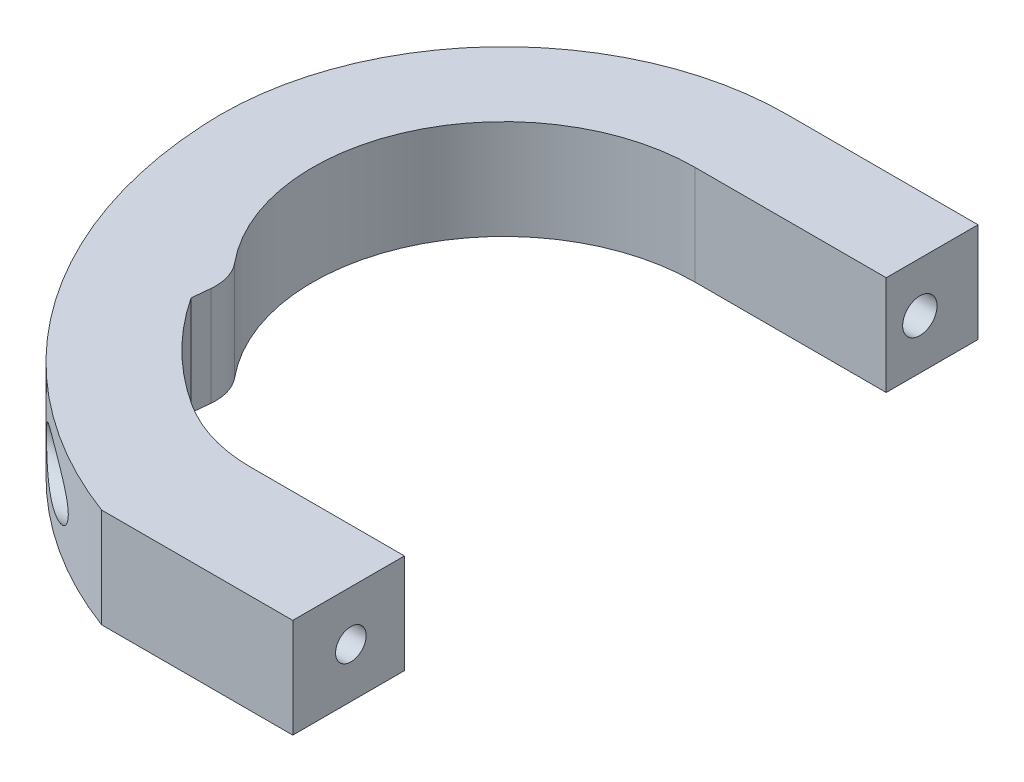
ISO-10303-21;
HEADER;
FILE_DESCRIPTION(('STEP AP214'),'2;1');
FILE_NAME('part.step','',(''),(''),'','','');
FILE_SCHEMA(('AUTOMOTIVE_DESIGN { 1 0 10303 214 1 1 1 1 }'));
ENDSEC;
DATA;
#1=APPLICATION_CONTEXT('core data for automotive mechanical design processes');
#2=APPLICATION_PROTOCOL_DEFINITION('international standard','automotive_design',2000,#1);
#3=PRODUCT_CONTEXT('',#1,'mechanical');
#4=PRODUCT('Part','Part','',(#3));
#5=PRODUCT_RELATED_PRODUCT_CATEGORY('part','',(#4));
#6=PRODUCT_DEFINITION_FORMATION('','',#4);
#7=PRODUCT_DEFINITION_CONTEXT('part definition',#1,'design');
#8=PRODUCT_DEFINITION('design','',#6,#7);
#9=PRODUCT_DEFINITION_SHAPE('','',#8);
#10=(LENGTH_UNIT() NAMED_UNIT(*) SI_UNIT(.MILLI.,.METRE.));
#11=(NAMED_UNIT(*) PLANE_ANGLE_UNIT() SI_UNIT($,.RADIAN.));
#12=(NAMED_UNIT(*) SI_UNIT($,.STERADIAN.) SOLID_ANGLE_UNIT());
#13=UNCERTAINTY_MEASURE_WITH_UNIT(LENGTH_MEASURE(1.E-05),#10,'distance_accuracy_value','');
#14=(GEOMETRIC_REPRESENTATION_CONTEXT(3) GLOBAL_UNCERTAINTY_ASSIGNED_CONTEXT((#13)) GLOBAL_UNIT_ASSIGNED_CONTEXT((#10,
#11,#12)) REPRESENTATION_CONTEXT('',''));
#15=CARTESIAN_POINT('',(0.,0.,0.));
#16=DIRECTION('',(0.,0.,1.));
#17=DIRECTION('',(1.,0.,0.));
#18=AXIS2_PLACEMENT_3D('',#15,#16,#17);
#19=CARTESIAN_POINT('',(2.43445709116473,12.5,9.));
#20=DIRECTION('',(0.,-1.,0.));
#21=DIRECTION('',(0.,0.,-1.));
#22=AXIS2_PLACEMENT_3D('',#19,#20,#21);
#23=CYLINDRICAL_SURFACE('',#22,10.);
#24=DIRECTION('',(0.,-1.,0.));
#25=VECTOR('',#24,1.);
#26=CARTESIAN_POINT('',(-2.98185755779115,12.5,17.4061605756437));
#27=LINE('',#26,#25);
#28=CARTESIAN_POINT('',(-2.98185755779116,6.5,17.4061605756437));
#29=VERTEX_POINT('',#28);
#30=CARTESIAN_POINT('',(-2.98185755779114,0.,17.4061605756437));
#31=VERTEX_POINT('',#30);
#32=EDGE_CURVE('E257',#29,#31,#27,.T.);
#33=ORIENTED_EDGE('',*,*,#32,.F.);
#34=CARTESIAN_POINT('',(2.43445709116473,6.5,9.));
#35=DIRECTION('',(0.,1.,0.));
#36=DIRECTION('',(0.,0.,1.));
#37=AXIS2_PLACEMENT_3D('',#34,#35,#36);
#38=CIRCLE('',#37,10.);
#39=CARTESIAN_POINT('',(2.43445709116473,6.5,19.));
#40=VERTEX_POINT('',#39);
#41=EDGE_CURVE('E50',#29,#40,#38,.T.);
#42=ORIENTED_EDGE('',*,*,#41,.T.);
#43=DIRECTION('',(0.,1.,0.));
#44=VECTOR('',#43,1.);
#45=CARTESIAN_POINT('',(2.43445709116473,12.5,19.));
#46=LINE('',#45,#44);
#47=CARTESIAN_POINT('',(2.43445709116473,0.,19.));
#48=VERTEX_POINT('',#47);
#49=EDGE_CURVE('E260',#48,#40,#46,.T.);
#50=ORIENTED_EDGE('',*,*,#49,.F.);
#51=CARTESIAN_POINT('',(2.43445709116473,0.,9.));
#52=DIRECTION('',(0.,1.,0.));
#53=DIRECTION('',(0.,0.,1.));
#54=AXIS2_PLACEMENT_3D('',#51,#52,#53);
#55=CIRCLE('',#54,10.);
#56=EDGE_CURVE('E11',#48,#31,#55,.F.);
#57=ORIENTED_EDGE('',*,*,#56,.T.);
#58=EDGE_LOOP('',(#33,#42,#50,#57));
#59=FACE_BOUND('',#58,.T.);
#60=ADVANCED_FACE('F37',(#59),#23,.F.);
#61=CARTESIAN_POINT('',(-11.9488198698751,6.5,9.87297846231208));
#62=DIRECTION('',(0.,-1.,0.));
#63=DIRECTION('',(0.,0.,-1.));
#64=AXIS2_PLACEMENT_3D('',#61,#62,#63);
#65=CYLINDRICAL_SURFACE('',#64,3.);
#66=DIRECTION('',(0.,1.,0.));
#67=VECTOR('',#66,1.);
#68=CARTESIAN_POINT('',(-8.96359133315928,6.5,10.1703176349375));
#69=LINE('',#68,#67);
#70=CARTESIAN_POINT('',(-8.96359133315928,0.,10.1703176349375));
#71=VERTEX_POINT('',#70);
#72=CARTESIAN_POINT('',(-8.96359133315928,6.5,10.1703176349375));
#73=VERTEX_POINT('',#72);
#74=EDGE_CURVE('E241',#71,#73,#69,.T.);
#75=ORIENTED_EDGE('',*,*,#74,.F.);
#76=CARTESIAN_POINT('',(-11.9488198698751,0.,9.87297846231208));
#77=DIRECTION('',(0.,1.,0.));
#78=DIRECTION('',(0.,0.,1.));
#79=AXIS2_PLACEMENT_3D('',#76,#77,#78);
#80=CIRCLE('',#79,3.);
#81=CARTESIAN_POINT('',(-9.63614505635088,0.,7.96207940509039));
#82=VERTEX_POINT('',#81);
#83=EDGE_CURVE('E253',#82,#71,#80,.F.);
#84=ORIENTED_EDGE('',*,*,#83,.F.);
#85=DIRECTION('',(0.,-1.,0.));
#86=VECTOR('',#85,1.);
#87=CARTESIAN_POINT('',(-9.63614505635088,6.5,7.96207940509039));
#88=LINE('',#87,#86);
#89=CARTESIAN_POINT('',(-9.63614505635088,6.5,7.96207940509039));
#90=VERTEX_POINT('',#89);
#91=EDGE_CURVE('E249',#90,#82,#88,.T.);
#92=ORIENTED_EDGE('',*,*,#91,.F.);
#93=CARTESIAN_POINT('',(-11.9488198698751,6.5,9.87297846231208));
#94=DIRECTION('',(0.,1.,0.));
#95=DIRECTION('',(0.,0.,1.));
#96=AXIS2_PLACEMENT_3D('',#93,#94,#95);
#97=CIRCLE('',#96,3.);
#98=EDGE_CURVE('E255',#73,#90,#97,.T.);
#99=ORIENTED_EDGE('',*,*,#98,.F.);
#100=EDGE_LOOP('',(#75,#84,#92,#99));
#101=FACE_BOUND('',#100,.T.);
#102=ADVANCED_FACE('F224',(#101),#65,.T.);
#103=CARTESIAN_POINT('',(0.,6.5,0.));
#104=DIRECTION('',(0.,1.,0.));
#105=DIRECTION('',(0.,0.,1.));
#106=AXIS2_PLACEMENT_3D('',#103,#104,#105);
#107=PLANE('',#106);
#108=DIRECTION('',(-0.0991130575418176,0.,0.99507617890527));
#109=VECTOR('',#108,1.);
#110=CARTESIAN_POINT('',(-7.87249039663224,6.5,-0.784127497190442));
#111=LINE('',#110,#109);
#112=CARTESIAN_POINT('',(-9.08243059939972,6.5,11.3634411838156));
#113=VERTEX_POINT('',#112);
#114=EDGE_CURVE('E183',#73,#113,#111,.T.);
#115=ORIENTED_EDGE('',*,*,#114,.F.);
#116=ORIENTED_EDGE('',*,*,#98,.T.);
#117=CARTESIAN_POINT('',(0.,6.5,0.));
#118=DIRECTION('',(0.,1.,0.));
#119=DIRECTION('',(0.,0.,1.));
#120=AXIS2_PLACEMENT_3D('',#117,#118,#119);
#121=CIRCLE('',#120,12.5);
#122=CARTESIAN_POINT('',(0.,6.5,-12.5));
#123=VERTEX_POINT('',#122);
#124=EDGE_CURVE('E297',#123,#90,#121,.T.);
#125=ORIENTED_EDGE('',*,*,#124,.F.);
#126=DIRECTION('',(-1.,0.,0.));
#127=VECTOR('',#126,1.);
#128=CARTESIAN_POINT('',(12.5,6.5,-12.5));
#129=LINE('',#128,#127);
#130=CARTESIAN_POINT('',(12.5,6.5,-12.5));
#131=VERTEX_POINT('',#130);
#132=EDGE_CURVE('E557',#131,#123,#129,.T.);
#133=ORIENTED_EDGE('',*,*,#132,.F.);
#134=DIRECTION('',(0.,0.,1.));
#135=VECTOR('',#134,1.);
#136=CARTESIAN_POINT('',(12.5,6.5,-12.5));
#137=LINE('',#136,#135);
#138=CARTESIAN_POINT('',(12.5,6.5,-18.5));
#139=VERTEX_POINT('',#138);
#140=EDGE_CURVE('E555',#139,#131,#137,.T.);
#141=ORIENTED_EDGE('',*,*,#140,.F.);
#142=DIRECTION('',(-1.,0.,0.));
#143=VECTOR('',#142,1.);
#144=CARTESIAN_POINT('',(12.5,6.5,-18.5));
#145=LINE('',#144,#143);
#146=CARTESIAN_POINT('',(0.,6.5,-18.5));
#147=VERTEX_POINT('',#146);
#148=EDGE_CURVE('E559',#139,#147,#145,.T.);
#149=ORIENTED_EDGE('',*,*,#148,.T.);
#150=CARTESIAN_POINT('',(0.,6.5,0.));
#151=DIRECTION('',(0.,1.,0.));
#152=DIRECTION('',(0.,0.,1.));
#153=AXIS2_PLACEMENT_3D('',#150,#151,#152);
#154=CIRCLE('',#153,18.5);
#155=CARTESIAN_POINT('',(-18.5,6.5,0.));
#156=VERTEX_POINT('',#155);
#157=EDGE_CURVE('E305',#147,#156,#154,.T.);
#158=ORIENTED_EDGE('',*,*,#157,.T.);
#159=CARTESIAN_POINT('',(-18.5,6.5,0.));
#160=CARTESIAN_POINT('',(-18.492115944136,6.5,0.64590870857176));
#161=CARTESIAN_POINT('',(-18.4549140462684,6.5,1.29079337805996));
#162=B_SPLINE_CURVE_WITH_KNOTS('',2,(#159,#160,#161),.UNSPECIFIED.,.F.,.F.,(3,3),(0.,1.),.UNSPECIFIED.);
#163=CARTESIAN_POINT('',(-18.4549140462684,6.5,1.29079337805996));
#164=VERTEX_POINT('',#163);
#165=EDGE_CURVE('E250',#156,#164,#162,.T.);
#166=ORIENTED_EDGE('',*,*,#165,.T.);
#167=CARTESIAN_POINT('',(9.9377916954311,6.5,-0.347115831386899));
#168=DIRECTION('',(0.,1.,0.));
#169=DIRECTION('',(0.,0.,1.));
#170=AXIS2_PLACEMENT_3D('',#167,#168,#169);
#171=CIRCLE('',#170,28.4399100897511);
#172=CARTESIAN_POINT('',(0.,6.5,26.3));
#173=VERTEX_POINT('',#172);
#174=EDGE_CURVE('E185',#173,#164,#171,.F.);
#175=ORIENTED_EDGE('',*,*,#174,.F.);
#176=DIRECTION('',(-1.,0.,0.));
#177=VECTOR('',#176,1.);
#178=CARTESIAN_POINT('',(12.5,6.5,26.3));
#179=LINE('',#178,#177);
#180=CARTESIAN_POINT('',(12.5,6.5,26.3));
#181=VERTEX_POINT('',#180);
#182=EDGE_CURVE('E277',#181,#173,#179,.T.);
#183=ORIENTED_EDGE('',*,*,#182,.F.);
#184=DIRECTION('',(0.,0.,1.));
#185=VECTOR('',#184,1.);
#186=CARTESIAN_POINT('',(12.5,6.5,26.3));
#187=LINE('',#186,#185);
#188=CARTESIAN_POINT('',(12.5,6.5,19.));
#189=VERTEX_POINT('',#188);
#190=EDGE_CURVE('E158',#189,#181,#187,.T.);
#191=ORIENTED_EDGE('',*,*,#190,.F.);
#192=DIRECTION('',(-1.,0.,0.));
#193=VECTOR('',#192,1.);
#194=CARTESIAN_POINT('',(12.5,6.5,19.));
#195=LINE('',#194,#193);
#196=EDGE_CURVE('E171',#189,#40,#195,.T.);
#197=ORIENTED_EDGE('',*,*,#196,.T.);
#198=ORIENTED_EDGE('',*,*,#41,.F.);
#199=CARTESIAN_POINT('',(8.26533127007783,6.5,-0.0495600461038349));
#200=DIRECTION('',(0.,1.,0.));
#201=DIRECTION('',(0.,0.,1.));
#202=AXIS2_PLACEMENT_3D('',#199,#200,#201);
#203=CIRCLE('',#202,20.7653904117944);
#204=EDGE_CURVE('E180',#113,#29,#203,.T.);
#205=ORIENTED_EDGE('',*,*,#204,.F.);
#206=EDGE_LOOP('',(#115,#116,#125,#133,#141,#149,#158,#166,#175,#183,#191,#197,#198,#205));
#207=FACE_BOUND('',#206,.T.);
#208=ADVANCED_FACE('F282',(#207),#107,.T.);
#209=CARTESIAN_POINT('',(0.,0.,0.));
#210=DIRECTION('',(0.,1.,0.));
#211=DIRECTION('',(0.,0.,1.));
#212=AXIS2_PLACEMENT_3D('',#209,#210,#211);
#213=PLANE('',#212);
#214=CARTESIAN_POINT('',(0.,0.,0.));
#215=DIRECTION('',(0.,1.,0.));
#216=DIRECTION('',(0.,0.,1.));
#217=AXIS2_PLACEMENT_3D('',#214,#215,#216);
#218=CIRCLE('',#217,12.5);
#219=CARTESIAN_POINT('',(0.,0.,-12.5));
#220=VERTEX_POINT('',#219);
#221=EDGE_CURVE('E303',#220,#82,#218,.T.);
#222=ORIENTED_EDGE('',*,*,#221,.T.);
#223=ORIENTED_EDGE('',*,*,#83,.T.);
#224=DIRECTION('',(0.0991130575418176,0.,-0.99507617890527));
#225=VECTOR('',#224,1.);
#226=CARTESIAN_POINT('',(-7.87249039663224,0.,-0.784127497190442));
#227=LINE('',#226,#225);
#228=CARTESIAN_POINT('',(-9.08243059939972,0.,11.3634411838156));
#229=VERTEX_POINT('',#228);
#230=EDGE_CURVE('E169',#229,#71,#227,.T.);
#231=ORIENTED_EDGE('',*,*,#230,.F.);
#232=CARTESIAN_POINT('',(8.26533127007783,0.,-0.0495600461038349));
#233=DIRECTION('',(0.,-1.,0.));
#234=DIRECTION('',(0.,0.,-1.));
#235=AXIS2_PLACEMENT_3D('',#232,#233,#234);
#236=CIRCLE('',#235,20.7653904117944);
#237=EDGE_CURVE('E167',#31,#229,#236,.T.);
#238=ORIENTED_EDGE('',*,*,#237,.F.);
#239=ORIENTED_EDGE('',*,*,#56,.F.);
#240=DIRECTION('',(-1.,0.,0.));
#241=VECTOR('',#240,1.);
#242=CARTESIAN_POINT('',(12.5,0.,19.));
#243=LINE('',#242,#241);
#244=CARTESIAN_POINT('',(12.5,0.,19.));
#245=VERTEX_POINT('',#244);
#246=EDGE_CURVE('E148',#245,#48,#243,.T.);
#247=ORIENTED_EDGE('',*,*,#246,.F.);
#248=DIRECTION('',(0.,0.,-1.));
#249=VECTOR('',#248,1.);
#250=CARTESIAN_POINT('',(12.5,0.,26.3));
#251=LINE('',#250,#249);
#252=CARTESIAN_POINT('',(12.5,0.,26.3));
#253=VERTEX_POINT('',#252);
#254=EDGE_CURVE('E139',#253,#245,#251,.T.);
#255=ORIENTED_EDGE('',*,*,#254,.F.);
#256=DIRECTION('',(-1.,0.,0.));
#257=VECTOR('',#256,1.);
#258=CARTESIAN_POINT('',(12.5,0.,26.3));
#259=LINE('',#258,#257);
#260=CARTESIAN_POINT('',(0.,0.,26.3));
#261=VERTEX_POINT('',#260);
#262=EDGE_CURVE('E145',#253,#261,#259,.T.);
#263=ORIENTED_EDGE('',*,*,#262,.T.);
#264=CARTESIAN_POINT('',(9.9377916954311,0.,-0.347115831386899));
#265=DIRECTION('',(0.,1.,0.));
#266=DIRECTION('',(0.,0.,1.));
#267=AXIS2_PLACEMENT_3D('',#264,#265,#266);
#268=CIRCLE('',#267,28.4399100897511);
#269=CARTESIAN_POINT('',(-18.4549140462684,0.,1.29079337805996));
#270=VERTEX_POINT('',#269);
#271=EDGE_CURVE('E187',#261,#270,#268,.F.);
#272=ORIENTED_EDGE('',*,*,#271,.T.);
#273=CARTESIAN_POINT('',(0.,0.,0.));
#274=DIRECTION('',(0.,1.,0.));
#275=DIRECTION('',(-1.,0.,0.));
#276=AXIS2_PLACEMENT_3D('',#273,#274,#275);
#277=CIRCLE('',#276,18.5);
#278=CARTESIAN_POINT('',(-18.5,0.,1.9260851594205E-13));
#279=VERTEX_POINT('',#278);
#280=EDGE_CURVE('E196',#279,#270,#277,.T.);
#281=ORIENTED_EDGE('',*,*,#280,.F.);
#282=CARTESIAN_POINT('',(0.,0.,0.));
#283=DIRECTION('',(0.,1.,0.));
#284=DIRECTION('',(0.,0.,1.));
#285=AXIS2_PLACEMENT_3D('',#282,#283,#284);
#286=CIRCLE('',#285,18.5);
#287=CARTESIAN_POINT('',(0.,0.,-18.5));
#288=VERTEX_POINT('',#287);
#289=EDGE_CURVE('E198',#288,#279,#286,.T.);
#290=ORIENTED_EDGE('',*,*,#289,.F.);
#291=DIRECTION('',(-1.,0.,0.));
#292=VECTOR('',#291,1.);
#293=CARTESIAN_POINT('',(12.5,0.,-18.5));
#294=LINE('',#293,#292);
#295=CARTESIAN_POINT('',(12.5,0.,-18.5));
#296=VERTEX_POINT('',#295);
#297=EDGE_CURVE('E561',#296,#288,#294,.T.);
#298=ORIENTED_EDGE('',*,*,#297,.F.);
#299=DIRECTION('',(0.,0.,-1.));
#300=VECTOR('',#299,1.);
#301=CARTESIAN_POINT('',(12.5,0.,-12.5));
#302=LINE('',#301,#300);
#303=CARTESIAN_POINT('',(12.5,0.,-12.5));
#304=VERTEX_POINT('',#303);
#305=EDGE_CURVE('E551',#304,#296,#302,.T.);
#306=ORIENTED_EDGE('',*,*,#305,.F.);
#307=DIRECTION('',(-1.,0.,0.));
#308=VECTOR('',#307,1.);
#309=CARTESIAN_POINT('',(12.5,0.,-12.5));
#310=LINE('',#309,#308);
#311=EDGE_CURVE('E562',#304,#220,#310,.T.);
#312=ORIENTED_EDGE('',*,*,#311,.T.);
#313=EDGE_LOOP('',(#222,#223,#231,#238,#239,#247,#255,#263,#272,#281,#290,#298,#306,#312));
#314=FACE_BOUND('',#313,.T.);
#315=ADVANCED_FACE('F142',(#314),#213,.F.);
#316=CARTESIAN_POINT('',(-18.5,3.25,-14.7));
#317=DIRECTION('',(1.,0.,0.));
#318=DIRECTION('',(0.,0.,-1.));
#319=AXIS2_PLACEMENT_3D('',#316,#317,#318);
#320=CYLINDRICAL_SURFACE('',#319,1.125);
#321=CARTESIAN_POINT('',(12.5,3.25,-14.7));
#322=DIRECTION('',(1.,0.,0.));
#323=DIRECTION('',(0.,0.,-1.));
#324=AXIS2_PLACEMENT_3D('',#321,#322,#323);
#325=CIRCLE('',#324,1.125);
#326=CARTESIAN_POINT('',(12.5,3.25,-15.825));
#327=VERTEX_POINT('',#326);
#328=EDGE_CURVE('E541',#327,#327,#325,.T.);
#329=ORIENTED_EDGE('',*,*,#328,.T.);
#330=EDGE_LOOP('',(#329));
#331=FACE_BOUND('',#330,.T.);
#332=CARTESIAN_POINT('',(6.,3.25,-14.7));
#333=DIRECTION('',(-1.,0.,0.));
#334=DIRECTION('',(0.,0.,1.));
#335=AXIS2_PLACEMENT_3D('',#332,#333,#334);
#336=CIRCLE('',#335,1.125);
#337=CARTESIAN_POINT('',(6.,3.25,-13.575));
#338=VERTEX_POINT('',#337);
#339=EDGE_CURVE('E537',#338,#338,#336,.F.);
#340=ORIENTED_EDGE('',*,*,#339,.F.);
#341=EDGE_LOOP('',(#340));
#342=FACE_BOUND('',#341,.T.);
#343=ADVANCED_FACE('F221',(#331,#342),#320,.F.);
#344=CARTESIAN_POINT('',(0.,6.5,0.));
#345=DIRECTION('',(0.,-1.,0.));
#346=DIRECTION('',(0.,0.,-1.));
#347=AXIS2_PLACEMENT_3D('',#344,#345,#346);
#348=CYLINDRICAL_SURFACE('',#347,18.5);
#349=ORIENTED_EDGE('',*,*,#280,.T.);
#350=DIRECTION('',(0.,-1.,0.));
#351=VECTOR('',#350,1.);
#352=CARTESIAN_POINT('',(-18.4549140462684,3.25,1.29079337805996));
#353=LINE('',#352,#351);
#354=EDGE_CURVE('E192',#270,#164,#353,.F.);
#355=ORIENTED_EDGE('',*,*,#354,.T.);
#356=ORIENTED_EDGE('',*,*,#165,.F.);
#357=ORIENTED_EDGE('',*,*,#157,.F.);
#358=DIRECTION('',(0.,-1.,0.));
#359=VECTOR('',#358,1.);
#360=CARTESIAN_POINT('',(0.,6.5,-18.5));
#361=LINE('',#360,#359);
#362=EDGE_CURVE('E306',#288,#147,#361,.F.);
#363=ORIENTED_EDGE('',*,*,#362,.F.);
#364=ORIENTED_EDGE('',*,*,#289,.T.);
#365=EDGE_LOOP('',(#349,#355,#356,#357,#363,#364));
#366=FACE_BOUND('',#365,.T.);
#367=CARTESIAN_POINT('',(-8.16639455328972,3.25,-16.6));
#368=CARTESIAN_POINT('',(-8.16640173482986,3.30186255349435,-16.5999967198748));
#369=CARTESIAN_POINT('',(-8.17076986025715,3.35380327107177,-16.5978497332591));
#370=CARTESIAN_POINT('',(-8.18771271861935,3.45603129124821,-16.5894979715708));
#371=CARTESIAN_POINT('',(-8.20030876480127,3.50631394253375,-16.5832826579947));
#372=CARTESIAN_POINT('',(-8.23661496116308,3.61691041266235,-16.5652852893057));
#373=CARTESIAN_POINT('',(-8.26238049128577,3.67637110030953,-16.5524672318081));
#374=CARTESIAN_POINT('',(-8.32191280967712,3.78993830617922,-16.522617284212));
#375=CARTESIAN_POINT('',(-8.3556953522869,3.84403398093558,-16.5055770941987));
#376=CARTESIAN_POINT('',(-8.45357731244129,3.98199387013994,-16.4557498567179));
#377=CARTESIAN_POINT('',(-8.52271234365229,4.06120257709374,-16.4201147607703));
#378=CARTESIAN_POINT('',(-8.6696341102887,4.20778062020223,-16.3430234261123));
#379=CARTESIAN_POINT('',(-8.74744496258733,4.27511553942186,-16.3015508722591));
#380=CARTESIAN_POINT('',(-8.90659658164503,4.39888443990974,-16.215134383934));
#381=CARTESIAN_POINT('',(-8.98783946025734,4.4555047127047,-16.170273498203));
#382=CARTESIAN_POINT('',(-9.15343353028854,4.56091447949631,-16.0771173158474));
#383=CARTESIAN_POINT('',(-9.23778743841026,4.60969692001882,-16.0288189815402));
#384=CARTESIAN_POINT('',(-9.40859495269877,4.70041753962559,-15.9291600498971));
#385=CARTESIAN_POINT('',(-9.49505242378449,4.74234182331844,-15.8777935164441));
#386=CARTESIAN_POINT('',(-9.66917842584711,4.81981532970054,-15.7723606055975));
#387=CARTESIAN_POINT('',(-9.75684724844059,4.85536298745513,-15.7182935696045));
#388=CARTESIAN_POINT('',(-9.96973097788036,4.9340379050052,-15.5844857746232));
#389=CARTESIAN_POINT('',(-10.0952907156763,4.97410286236688,-15.5034774667946));
#390=CARTESIAN_POINT('',(-10.3466608595466,5.04234685391553,-15.3368632547554));
#391=CARTESIAN_POINT('',(-10.4724713599461,5.07051989869334,-15.2512550582023));
#392=CARTESIAN_POINT('',(-10.7231940246681,5.11460644907582,-15.0760225806637));
#393=CARTESIAN_POINT('',(-10.8481072183535,5.13053747375495,-14.9864042336747));
#394=CARTESIAN_POINT('',(-11.0962185935563,5.14939212090841,-14.8036371334364));
#395=CARTESIAN_POINT('',(-11.2194177359257,5.15232334989638,-14.710490476882));
#396=CARTESIAN_POINT('',(-11.5018292394835,5.1426264649113,-14.4913465908793));
#397=CARTESIAN_POINT('',(-11.660091638344,5.12477728353632,-14.3642872272495));
#398=CARTESIAN_POINT('',(-11.9688324498059,5.06025196409398,-14.1080492970735));
#399=CARTESIAN_POINT('',(-12.1193239425898,5.01362609968841,-13.9788748080091));
#400=CARTESIAN_POINT('',(-12.3658522910293,4.90462447661389,-13.7606131400659));
#401=CARTESIAN_POINT('',(-12.4649923046703,4.85077944816442,-13.6707985129316));
#402=CARTESIAN_POINT('',(-12.65440441278,4.72350851991878,-13.4956497068659));
#403=CARTESIAN_POINT('',(-12.7446885821978,4.65010980400972,-13.4103095031435));
#404=CARTESIAN_POINT('',(-12.8909326614921,4.50353520992022,-13.2695664699849));
#405=CARTESIAN_POINT('',(-12.9497398729216,4.4351835023944,-13.2121188677211));
#406=CARTESIAN_POINT('',(-13.0582706890999,4.28629842112052,-13.1048601889965));
#407=CARTESIAN_POINT('',(-13.1080063524963,4.20578148274493,-13.0550389892753));
#408=CARTESIAN_POINT('',(-13.1876805787623,4.04930508028899,-12.9745014172421));
#409=CARTESIAN_POINT('',(-13.2195813196159,3.97529492222092,-12.9419549144856));
#410=CARTESIAN_POINT('',(-13.2742443497292,3.82072077024941,-12.8858828076323));
#411=CARTESIAN_POINT('',(-13.2970112704493,3.74016012287169,-12.8623526319243));
#412=CARTESIAN_POINT('',(-13.332204564795,3.57391655292425,-12.8258716001936));
#413=CARTESIAN_POINT('',(-13.3445674185757,3.48820554001581,-12.8129857394758));
#414=CARTESIAN_POINT('',(-13.3578616768124,3.31495185264707,-12.7991262468118));
#415=CARTESIAN_POINT('',(-13.3587978877214,3.22740996384168,-12.7981476062654));
#416=CARTESIAN_POINT('',(-13.3496854433465,3.06256323928939,-12.8076509893484));
#417=CARTESIAN_POINT('',(-13.3407464655187,2.98512427743931,-12.8169752905124));
#418=CARTESIAN_POINT('',(-13.3141299544623,2.83344827289181,-12.8446217575379));
#419=CARTESIAN_POINT('',(-13.2964522311032,2.75921129989889,-12.8629441191718));
#420=CARTESIAN_POINT('',(-13.2527305399352,2.61390678128023,-12.9079870670832));
#421=CARTESIAN_POINT('',(-13.2265002037835,2.54295429441887,-12.9348944171277));
#422=CARTESIAN_POINT('',(-13.1669482358112,2.4072368991043,-12.9955101202548));
#423=CARTESIAN_POINT('',(-13.1336230427776,2.34247512177656,-13.0292218883238));
#424=CARTESIAN_POINT('',(-13.04425318454,2.19137377928299,-13.1188053270481));
#425=CARTESIAN_POINT('',(-12.9848154349801,2.1088419380125,-13.1777301610809));
#426=CARTESIAN_POINT('',(-12.8562979154674,1.95831555462991,-13.3031471096447));
#427=CARTESIAN_POINT('',(-12.7871976082642,1.89035277878311,-13.3696552850754));
#428=CARTESIAN_POINT('',(-12.6117995683413,1.74299851464794,-13.5355965119496));
#429=CARTESIAN_POINT('',(-12.5019157972603,1.67045708738879,-13.6372942370644));
#430=CARTESIAN_POINT('',(-12.272575743069,1.54948493953799,-13.8440552449966));
#431=CARTESIAN_POINT('',(-12.1531036657734,1.50109498922052,-13.9491239023118));
#432=CARTESIAN_POINT('',(-11.9399004851579,1.43513436795367,-14.1316327512488));
#433=CARTESIAN_POINT('',(-11.8476080986214,1.41281343732938,-14.2091127977965));
#434=CARTESIAN_POINT('',(-11.6603478113158,1.37842619140885,-14.3631816310721));
#435=CARTESIAN_POINT('',(-11.5653786404062,1.36636483190641,-14.4397699694712));
#436=CARTESIAN_POINT('',(-11.3733736493397,1.35156885882375,-14.5914829047581));
#437=CARTESIAN_POINT('',(-11.276335045756,1.34884772363737,-14.6666052309294));
#438=CARTESIAN_POINT('',(-11.0808970862748,1.35202465856806,-14.81481555224));
#439=CARTESIAN_POINT('',(-10.9824979401467,1.35792141433241,-14.8879038558647));
#440=CARTESIAN_POINT('',(-10.7807711761087,1.37818029154557,-15.0346652559569));
#441=CARTESIAN_POINT('',(-10.6774063518046,1.39287817972432,-15.1082404143051));
#442=CARTESIAN_POINT('',(-10.4702159724624,1.43059265069204,-15.2525578299897));
#443=CARTESIAN_POINT('',(-10.3663903855828,1.4536098175221,-15.3232998880456));
#444=CARTESIAN_POINT('',(-10.1589459724847,1.50774220234109,-15.4616082235168));
#445=CARTESIAN_POINT('',(-10.0553270594251,1.5388461240723,-15.5291787769421));
#446=CARTESIAN_POINT('',(-9.84880435996082,1.60923539443353,-15.6609727525617));
#447=CARTESIAN_POINT('',(-9.74590035517221,1.64851811987638,-15.7251972397026));
#448=CARTESIAN_POINT('',(-9.51671391525342,1.74623478564853,-15.8651890500292));
#449=CARTESIAN_POINT('',(-9.39080439746738,1.80700278661153,-15.9399855188795));
#450=CARTESIAN_POINT('',(-9.20534440365705,1.90942558939226,-16.047328988146));
#451=CARTESIAN_POINT('',(-9.14407046824517,1.94545990568381,-16.0823132560146));
#452=CARTESIAN_POINT('',(-9.02313651554476,2.02169289256044,-16.1504742500726));
#453=CARTESIAN_POINT('',(-8.96347610147671,2.06189052738654,-16.1836514227158));
#454=CARTESIAN_POINT('',(-8.82015731518434,2.16600976717641,-16.2623539324424));
#455=CARTESIAN_POINT('',(-8.73771420712158,2.23249511124186,-16.3067570189359));
#456=CARTESIAN_POINT('',(-8.58083040794062,2.37742764475839,-16.3898485067809));
#457=CARTESIAN_POINT('',(-8.50636697213627,2.45583920641086,-16.4285532748594));
#458=CARTESIAN_POINT('',(-8.40273512973145,2.58810459190894,-16.4816792636499));
#459=CARTESIAN_POINT('',(-8.36846062406583,2.6367182257936,-16.4990940835155));
#460=CARTESIAN_POINT('',(-8.30587988348447,2.73869431100557,-16.5306859441071));
#461=CARTESIAN_POINT('',(-8.27756959219968,2.79205349944211,-16.5448651859571));
#462=CARTESIAN_POINT('',(-8.23306565543554,2.89445574138828,-16.5670501899579));
#463=CARTESIAN_POINT('',(-8.21565926926934,2.94282827685293,-16.5756800893793));
#464=CARTESIAN_POINT('',(-8.18823071810131,3.04207598665935,-16.5892470663166));
#465=CARTESIAN_POINT('',(-8.17818713839475,3.09294344039586,-16.5941948538869));
#466=CARTESIAN_POINT('',(-8.17038448134512,3.16186386046853,-16.5980366426283));
#467=CARTESIAN_POINT('',(-8.1688917891752,3.17944591253951,-16.5987712920044));
#468=CARTESIAN_POINT('',(-8.16689551063423,3.21468227900198,-16.5997535743493));
#469=CARTESIAN_POINT('',(-8.1663921073945,3.2323366061666,-16.6000011171479));
#470=CARTESIAN_POINT('',(-8.16639455328972,3.25,-16.6));
#471=B_SPLINE_CURVE_WITH_KNOTS('',3,(#367,#368,#369,#370,#371,#372,#373,#374,#375,#376,#377,
#378,#379,#380,#381,#382,#383,#384,#385,#386,#387,#388,#389,#390,#391,#392,#393,#394,#395,#396,
#397,#398,#399,#400,#401,#402,#403,#404,#405,#406,#407,#408,#409,#410,#411,#412,#413,#414,#415,
#416,#417,#418,#419,#420,#421,#422,#423,#424,#425,#426,#427,#428,#429,#430,#431,#432,#433,#434,
#435,#436,#437,#438,#439,#440,#441,#442,#443,#444,#445,#446,#447,#448,#449,#450,#451,#452,#453,
#454,#455,#456,#457,#458,#459,#460,#461,#462,#463,#464,#465,#466,#467,#468,#469,#470),
.UNSPECIFIED.,.T.,.F.,(4,2,2,2,2,2,2,2,2,2,2,2,2,2,2,2,2,2,2,2,2,2,2,2,2,2,2,2,2,2,2,2,2,2,2,2,
2,2,2,2,2,2,2,2,2,2,2,2,2,2,2,4),(0.,0.155510480124692,0.311425393833759,0.508472186772613,
0.705909453186188,1.03708071031562,1.36919665037441,1.69486330929647,2.02082142234117,
2.34743199516824,2.6741226145599,3.13765795910673,3.60142648731206,4.06453009219641,
4.52736268751116,5.1367590709365,5.74509382387122,6.17641470808846,6.60713906342841,
6.92678286901619,7.24599863090553,7.50569676121391,7.76526304017743,8.02640278090973,
8.28743267317912,8.52186263180138,8.75629769118559,8.9962271714871,9.23627736782436,
9.58693935795561,9.93835832213474,10.4347385051543,10.9319538205104,11.2991444618359,
11.6665123707468,12.0344101868913,12.402251899166,12.7851105735517,13.1679961311153,
13.5503496890799,13.9325808032047,14.407370062407,14.6449347864964,14.882440550065,
15.2262865038373,15.5691247433857,15.754655437793,15.9400595391606,16.0958702389283,
16.2512259459338,16.3041800396541,16.3571439350004),.UNSPECIFIED.);
#472=CARTESIAN_POINT('',(-8.16639455328972,3.25,-16.6));
#473=VERTEX_POINT('',#472);
#474=EDGE_CURVE('E228',#473,#473,#471,.T.);
#475=ORIENTED_EDGE('',*,*,#474,.T.);
#476=EDGE_LOOP('',(#475));
#477=FACE_BOUND('',#476,.T.);
#478=ADVANCED_FACE('F211',(#366,#477),#348,.T.);
#479=CARTESIAN_POINT('',(0.,6.5,0.));
#480=DIRECTION('',(0.,-1.,0.));
#481=DIRECTION('',(0.,0.,-1.));
#482=AXIS2_PLACEMENT_3D('',#479,#480,#481);
#483=CYLINDRICAL_SURFACE('',#482,12.5);
#484=ORIENTED_EDGE('',*,*,#124,.T.);
#485=ORIENTED_EDGE('',*,*,#91,.T.);
#486=ORIENTED_EDGE('',*,*,#221,.F.);
#487=DIRECTION('',(0.,-1.,0.));
#488=VECTOR('',#487,1.);
#489=CARTESIAN_POINT('',(0.,6.5,-12.5));
#490=LINE('',#489,#488);
#491=EDGE_CURVE('E197',#220,#123,#490,.F.);
#492=ORIENTED_EDGE('',*,*,#491,.T.);
#493=EDGE_LOOP('',(#484,#485,#486,#492));
#494=FACE_BOUND('',#493,.T.);
#495=ADVANCED_FACE('F220',(#494),#483,.F.);
#496=CARTESIAN_POINT('',(-18.5,3.25,-14.7));
#497=DIRECTION('',(1.,0.,0.));
#498=DIRECTION('',(0.,0.,-1.));
#499=AXIS2_PLACEMENT_3D('',#496,#497,#498);
#500=CYLINDRICAL_SURFACE('',#499,1.9);
#501=ORIENTED_EDGE('',*,*,#474,.F.);
#502=EDGE_LOOP('',(#501));
#503=FACE_BOUND('',#502,.T.);
#504=CARTESIAN_POINT('',(6.,3.25,-14.7));
#505=DIRECTION('',(-1.,0.,0.));
#506=DIRECTION('',(0.,0.,1.));
#507=AXIS2_PLACEMENT_3D('',#504,#505,#506);
#508=CIRCLE('',#507,1.9);
#509=CARTESIAN_POINT('',(6.,3.25,-12.8));
#510=VERTEX_POINT('',#509);
#511=EDGE_CURVE('E535',#510,#510,#508,.T.);
#512=ORIENTED_EDGE('',*,*,#511,.F.);
#513=EDGE_LOOP('',(#512));
#514=FACE_BOUND('',#513,.T.);
#515=ADVANCED_FACE('F326',(#503,#514),#500,.F.);
#516=CARTESIAN_POINT('',(12.5,0.,0.));
#517=DIRECTION('',(1.,0.,0.));
#518=DIRECTION('',(0.,0.,-1.));
#519=AXIS2_PLACEMENT_3D('',#516,#517,#518);
#520=PLANE('',#519);
#521=DIRECTION('',(0.,-1.,0.));
#522=VECTOR('',#521,1.);
#523=CARTESIAN_POINT('',(12.5,6.5,-12.5));
#524=LINE('',#523,#522);
#525=EDGE_CURVE('E548',#131,#304,#524,.T.);
#526=ORIENTED_EDGE('',*,*,#525,.T.);
#527=ORIENTED_EDGE('',*,*,#305,.T.);
#528=DIRECTION('',(0.,1.,0.));
#529=VECTOR('',#528,1.);
#530=CARTESIAN_POINT('',(12.5,6.5,-18.5));
#531=LINE('',#530,#529);
#532=EDGE_CURVE('E553',#296,#139,#531,.T.);
#533=ORIENTED_EDGE('',*,*,#532,.T.);
#534=ORIENTED_EDGE('',*,*,#140,.T.);
#535=EDGE_LOOP('',(#526,#527,#533,#534));
#536=FACE_BOUND('',#535,.T.);
#537=ORIENTED_EDGE('',*,*,#328,.F.);
#538=EDGE_LOOP('',(#537));
#539=FACE_BOUND('',#538,.T.);
#540=ADVANCED_FACE('F332',(#536,#539),#520,.T.);
#541=CARTESIAN_POINT('',(12.5,6.5,-12.5));
#542=DIRECTION('',(0.,0.,-1.));
#543=DIRECTION('',(-1.,0.,0.));
#544=AXIS2_PLACEMENT_3D('',#541,#542,#543);
#545=PLANE('',#544);
#546=ORIENTED_EDGE('',*,*,#491,.F.);
#547=ORIENTED_EDGE('',*,*,#311,.F.);
#548=ORIENTED_EDGE('',*,*,#525,.F.);
#549=ORIENTED_EDGE('',*,*,#132,.T.);
#550=EDGE_LOOP('',(#546,#547,#548,#549));
#551=FACE_BOUND('',#550,.T.);
#552=ADVANCED_FACE('F334',(#551),#545,.F.);
#553=CARTESIAN_POINT('',(12.5,6.5,-18.5));
#554=DIRECTION('',(0.,0.,1.));
#555=DIRECTION('',(1.,0.,0.));
#556=AXIS2_PLACEMENT_3D('',#553,#554,#555);
#557=PLANE('',#556);
#558=ORIENTED_EDGE('',*,*,#362,.T.);
#559=ORIENTED_EDGE('',*,*,#148,.F.);
#560=ORIENTED_EDGE('',*,*,#532,.F.);
#561=ORIENTED_EDGE('',*,*,#297,.T.);
#562=EDGE_LOOP('',(#558,#559,#560,#561));
#563=FACE_BOUND('',#562,.T.);
#564=ADVANCED_FACE('F337',(#563),#557,.F.);
#565=CARTESIAN_POINT('',(6.,3.25,-14.7));
#566=DIRECTION('',(-1.,0.,0.));
#567=DIRECTION('',(0.,0.,1.));
#568=AXIS2_PLACEMENT_3D('',#565,#566,#567);
#569=PLANE('',#568);
#570=ORIENTED_EDGE('',*,*,#511,.T.);
#571=EDGE_LOOP('',(#570));
#572=FACE_BOUND('',#571,.T.);
#573=ORIENTED_EDGE('',*,*,#339,.T.);
#574=EDGE_LOOP('',(#573));
#575=FACE_BOUND('',#574,.T.);
#576=ADVANCED_FACE('F341',(#572,#575),#569,.T.);
#577=CARTESIAN_POINT('',(9.9377916954311,38.6549374124721,-0.347115831386899));
#578=DIRECTION('',(0.,-1.,0.));
#579=DIRECTION('',(0.,0.,-1.));
#580=AXIS2_PLACEMENT_3D('',#577,#578,#579);
#581=CYLINDRICAL_SURFACE('',#580,28.4399100897511);
#582=CARTESIAN_POINT('',(-9.29880946640593,3.25,20.6));
#583=CARTESIAN_POINT('',(-9.2988072714918,3.16808268664594,20.6000021969084));
#584=CARTESIAN_POINT('',(-9.29299585857397,3.08615080360006,20.6053433582938));
#585=CARTESIAN_POINT('',(-9.27023828502644,2.92518571283391,20.6262076214653));
#586=CARTESIAN_POINT('',(-9.25328469191648,2.84615447719445,20.6417375197177));
#587=CARTESIAN_POINT('',(-9.20967322042932,2.69382745662674,20.6815294893016));
#588=CARTESIAN_POINT('',(-9.18308179379974,2.62049647586919,20.7057317530123));
#589=CARTESIAN_POINT('',(-9.12176588723107,2.48027459903678,20.7612584215774));
#590=CARTESIAN_POINT('',(-9.08703753676288,2.41338678924915,20.7925862156587));
#591=CARTESIAN_POINT('',(-8.9948856581729,2.25975863397425,20.8752178977632));
#592=CARTESIAN_POINT('',(-8.93407538662855,2.1765855791241,20.9293668009932));
#593=CARTESIAN_POINT('',(-8.8027852009819,2.02424907365084,21.0451020304067));
#594=CARTESIAN_POINT('',(-8.73228438286105,1.95511673224611,21.1067043995091));
#595=CARTESIAN_POINT('',(-8.54912850821194,1.80010406475148,21.2649859947198));
#596=CARTESIAN_POINT('',(-8.43237651189873,1.72190497578247,21.3644092054417));
#597=CARTESIAN_POINT('',(-8.18939997853823,1.59002622699899,21.5676890938725));
#598=CARTESIAN_POINT('',(-8.06315855237407,1.53639154978533,21.6715535272817));
#599=CARTESIAN_POINT('',(-7.83671376131421,1.46100424450887,21.8544858346703));
#600=CARTESIAN_POINT('',(-7.73780245759139,1.43464577095465,21.9333260250422));
#601=CARTESIAN_POINT('',(-7.53747687452713,1.39280004163512,22.0907919404752));
#602=CARTESIAN_POINT('',(-7.43606135263416,1.37731829967165,22.1694175366631));
#603=CARTESIAN_POINT('',(-7.23136303306511,1.35634572244634,22.3258911554868));
#604=CARTESIAN_POINT('',(-7.12807731607575,1.35087216781211,22.4037376028223));
#605=CARTESIAN_POINT('',(-6.92043459308913,1.34932023060226,22.5580237881873));
#606=CARTESIAN_POINT('',(-6.81607777816269,1.35324020037399,22.6344637705451));
#607=CARTESIAN_POINT('',(-6.60273962972676,1.37037262383223,22.7885122473204));
#608=CARTESIAN_POINT('',(-6.49373631226702,1.3839406132376,22.8660505325175));
#609=CARTESIAN_POINT('',(-6.2756951829025,1.42053173454229,23.018864928119));
#610=CARTESIAN_POINT('',(-6.16665736875122,1.44355699085376,23.0941405261698));
#611=CARTESIAN_POINT('',(-5.94946366141181,1.49905009869189,23.2418818184296));
#612=CARTESIAN_POINT('',(-5.84130629653944,1.53149559850882,23.3143537090622));
#613=CARTESIAN_POINT('',(-5.62644717123212,1.6062112212195,23.4562350558435));
#614=CARTESIAN_POINT('',(-5.51974468536852,1.64847624297426,23.5256460798807));
#615=CARTESIAN_POINT('',(-5.30325084781115,1.74614300174883,23.6644750082712));
#616=CARTESIAN_POINT('',(-5.19359270436817,1.8021192862377,23.7337008163479));
#617=CARTESIAN_POINT('',(-4.97884047642861,1.92755002572291,23.8673120457816));
#618=CARTESIAN_POINT('',(-4.87374891608043,1.99701182162726,23.9316948041945));
#619=CARTESIAN_POINT('',(-4.68881642419489,2.13894581524986,24.0434656581573));
#620=CARTESIAN_POINT('',(-4.60770869467918,2.20892783899555,24.0918874620097));
#621=CARTESIAN_POINT('',(-4.45491314869886,2.36221529109306,24.1821790081986));
#622=CARTESIAN_POINT('',(-4.38319662931835,2.44547831121054,24.2240687933543));
#623=CARTESIAN_POINT('',(-4.28376179837253,2.58769433340103,24.2816814558529));
#624=CARTESIAN_POINT('',(-4.25051584412297,2.64135993618197,24.3008374174733));
#625=CARTESIAN_POINT('',(-4.19104398695361,2.75371421772352,24.3349759574584));
#626=CARTESIAN_POINT('',(-4.16480898184033,2.81239625172973,24.3499639480647));
#627=CARTESIAN_POINT('',(-4.12480547118203,2.92510317159579,24.3727608420741));
#628=CARTESIAN_POINT('',(-4.10976146571146,2.97851797135962,24.3813069348487));
#629=CARTESIAN_POINT('',(-4.08769371869797,3.08750085407699,24.3938301961322));
#630=CARTESIAN_POINT('',(-4.08066238529739,3.14306684710247,24.3978116895356));
#631=CARTESIAN_POINT('',(-4.07535216663408,3.25494251855834,24.4008193699184));
#632=CARTESIAN_POINT('',(-4.07710131368805,3.31125400568857,24.3998296860497));
#633=CARTESIAN_POINT('',(-4.08921483396601,3.42263833554598,24.3929653762499));
#634=CARTESIAN_POINT('',(-4.09958520111126,3.47771028911696,24.3870873516887));
#635=CARTESIAN_POINT('',(-4.13059844200726,3.59538562680593,24.3694626818382));
#636=CARTESIAN_POINT('',(-4.15281923407026,3.65743080081974,24.3568129011866));
#637=CARTESIAN_POINT('',(-4.20562349332411,3.77655286383603,24.3266195444786));
#638=CARTESIAN_POINT('',(-4.23622256558218,3.83362021718437,24.3090668351713));
#639=CARTESIAN_POINT('',(-4.32180069369176,3.97205801735578,24.2597136935732));
#640=CARTESIAN_POINT('',(-4.38101063190397,4.04986138200689,24.2253441758812));
#641=CARTESIAN_POINT('',(-4.50840254840531,4.194425289029,24.150668873552));
#642=CARTESIAN_POINT('',(-4.57660731479125,4.2611567776548,24.1103479792921));
#643=CARTESIAN_POINT('',(-4.7120037281377,4.37931906141973,24.0294634400158));
#644=CARTESIAN_POINT('',(-4.77869253828964,4.43159739955621,23.9892758494276));
#645=CARTESIAN_POINT('',(-4.915283712042,4.52939693711972,23.906152769577));
#646=CARTESIAN_POINT('',(-4.98518856881694,4.57491277438899,23.8632151379345));
#647=CARTESIAN_POINT('',(-5.12732458241525,4.65998744348911,23.7750268527984));
#648=CARTESIAN_POINT('',(-5.19955973402295,4.69953530504939,23.7297721396686));
#649=CARTESIAN_POINT('',(-5.34559328451611,4.7731371464484,23.6373397073805));
#650=CARTESIAN_POINT('',(-5.41939215186085,4.80718945282712,23.5901614079256));
#651=CARTESIAN_POINT('',(-5.61224128896725,4.88891290783673,23.4655873879492));
#652=CARTESIAN_POINT('',(-5.73212813990414,4.93265633086987,23.3868910689139));
#653=CARTESIAN_POINT('',(-5.97330684920566,5.00812048941155,23.2258875498387));
#654=CARTESIAN_POINT('',(-6.09459950389355,5.0398340292724,23.143578221419));
#655=CARTESIAN_POINT('',(-6.33760329006508,5.09153337080491,22.9758728964814));
#656=CARTESIAN_POINT('',(-6.45931453738305,5.11151561021531,22.8904759707489));
#657=CARTESIAN_POINT('',(-6.70224227715783,5.13959089239561,22.7171423371818));
#658=CARTESIAN_POINT('',(-6.82345894907537,5.14768871852351,22.6292066657067));
#659=CARTESIAN_POINT('',(-7.04108485344029,5.1510899976983,22.4686855481805));
#660=CARTESIAN_POINT('',(-7.13772166947734,5.148580692311,22.3964510706639));
#661=CARTESIAN_POINT('',(-7.3297124001798,5.13503290025244,22.2510320042945));
#662=CARTESIAN_POINT('',(-7.42506617627598,5.12399349972868,22.1778473144688));
#663=CARTESIAN_POINT('',(-7.61371180986239,5.09277100643772,22.0311649299823));
#664=CARTESIAN_POINT('',(-7.70700769107,5.07260779835019,21.9576682585359));
#665=CARTESIAN_POINT('',(-7.89098878906177,5.02232394900968,21.8108831088766));
#666=CARTESIAN_POINT('',(-7.98167534535552,4.99220851962468,21.7375945419003));
#667=CARTESIAN_POINT('',(-8.18070550162978,4.91252866938773,21.5747619931784));
#668=CARTESIAN_POINT('',(-8.28813271640385,4.86004489746726,21.4854873743134));
#669=CARTESIAN_POINT('',(-8.49506767891397,4.73588453079101,21.3110560209926));
#670=CARTESIAN_POINT('',(-8.59458404355947,4.66422920082318,21.2258948467767));
#671=CARTESIAN_POINT('',(-8.75801069168814,4.5200990397423,21.0842644627514));
#672=CARTESIAN_POINT('',(-8.82455787572692,4.45242188477578,21.0259887269815));
#673=CARTESIAN_POINT('',(-8.94850360412378,4.30409756121147,20.9165417194551));
#674=CARTESIAN_POINT('',(-9.00591598541458,4.22347038822796,20.8653597179299));
#675=CARTESIAN_POINT('',(-9.09624233183383,4.06978674363518,20.784302197045));
#676=CARTESIAN_POINT('',(-9.13174214989709,3.99941199661448,20.7522469273392));
#677=CARTESIAN_POINT('',(-9.19368073301153,3.85179920631024,20.6961015792713));
#678=CARTESIAN_POINT('',(-9.22012925014112,3.77456866336568,20.672002929258));
#679=CARTESIAN_POINT('',(-9.25995563906885,3.62348861906861,20.6356303871487));
#680=CARTESIAN_POINT('',(-9.27443568871799,3.55017305559398,20.6223613682332));
#681=CARTESIAN_POINT('',(-9.29386218277609,3.40124200194313,20.6045464715438));
#682=CARTESIAN_POINT('',(-9.29881149278136,3.32562721002114,20.5999979717834));
#683=CARTESIAN_POINT('',(-9.29880946640593,3.25,20.6));
#684=B_SPLINE_CURVE_WITH_KNOTS('',3,(#582,#583,#584,#585,#586,#587,#588,#589,#590,#591,#592,
#593,#594,#595,#596,#597,#598,#599,#600,#601,#602,#603,#604,#605,#606,#607,#608,#609,#610,#611,
#612,#613,#614,#615,#616,#617,#618,#619,#620,#621,#622,#623,#624,#625,#626,#627,#628,#629,#630,
#631,#632,#633,#634,#635,#636,#637,#638,#639,#640,#641,#642,#643,#644,#645,#646,#647,#648,#649,
#650,#651,#652,#653,#654,#655,#656,#657,#658,#659,#660,#661,#662,#663,#664,#665,#666,#667,#668,
#669,#670,#671,#672,#673,#674,#675,#676,#677,#678,#679,#680,#681,#682,#683),.UNSPECIFIED.,.T.,
.F.,(4,2,2,2,2,2,2,2,2,2,2,2,2,2,2,2,2,2,2,2,2,2,2,2,2,2,2,2,2,2,2,2,2,2,2,2,2,2,2,2,2,2,2,2,2,
2,2,2,2,2,4),(0.,0.245416133524069,0.49099614022454,0.734914146194682,0.978948414198757,
1.32618754600992,1.67418783881779,2.18776212115991,2.70227314219574,3.08939463994088,
3.47671224200503,3.86469797640751,4.25261566191848,4.65562290652785,5.05872072932776,
5.46086981810541,5.86281045992202,6.28591600682809,6.7092525225123,7.06108484847198,
7.41181541844051,7.60920278065958,7.80633261941131,7.97407166204018,8.14165164256169,
8.30976697385701,8.47799928553318,8.67820935011807,8.87879488526271,9.18796426063061,
9.49793251872408,9.77888443720189,10.0600579540764,10.3417421851163,10.623512031067,
11.0726787648723,11.5221137446853,11.9716851269246,12.4210755114878,12.7828227083419,
13.1446086655395,13.5056099060173,13.8664223929447,14.3128517695608,14.7587880120047,
15.0918572154295,15.4244169981898,15.6787353268928,15.9327787781369,16.1594185410632,
16.3859901498314),.UNSPECIFIED.);
#685=CARTESIAN_POINT('',(-9.29880946640593,3.25,20.6));
#686=VERTEX_POINT('',#685);
#687=EDGE_CURVE('E40',#686,#686,#684,.T.);
#688=ORIENTED_EDGE('',*,*,#687,.F.);
#689=EDGE_LOOP('',(#688));
#690=FACE_BOUND('',#689,.T.);
#691=ORIENTED_EDGE('',*,*,#354,.F.);
#692=ORIENTED_EDGE('',*,*,#271,.F.);
#693=DIRECTION('',(0.,-1.,0.));
#694=VECTOR('',#693,1.);
#695=CARTESIAN_POINT('',(0.,38.6549374124721,26.3));
#696=LINE('',#695,#694);
#697=EDGE_CURVE('E165',#173,#261,#696,.T.);
#698=ORIENTED_EDGE('',*,*,#697,.F.);
#699=ORIENTED_EDGE('',*,*,#174,.T.);
#700=EDGE_LOOP('',(#691,#692,#698,#699));
#701=FACE_BOUND('',#700,.T.);
#702=ADVANCED_FACE('F347',(#690,#701),#581,.T.);
#703=CARTESIAN_POINT('',(-7.87249039663224,12.5,-0.784127497190442));
#704=DIRECTION('',(-0.99507617890527,0.,-0.0991130575418176));
#705=DIRECTION('',(-0.0991130575418176,0.,0.99507617890527));
#706=AXIS2_PLACEMENT_3D('',#703,#704,#705);
#707=PLANE('',#706);
#708=ORIENTED_EDGE('',*,*,#230,.T.);
#709=ORIENTED_EDGE('',*,*,#74,.T.);
#710=ORIENTED_EDGE('',*,*,#114,.T.);
#711=DIRECTION('',(0.,-1.,0.));
#712=VECTOR('',#711,1.);
#713=CARTESIAN_POINT('',(-9.08243059939972,12.5,11.3634411838156));
#714=LINE('',#713,#712);
#715=EDGE_CURVE('E177',#113,#229,#714,.T.);
#716=ORIENTED_EDGE('',*,*,#715,.T.);
#717=EDGE_LOOP('',(#708,#709,#710,#716));
#718=FACE_BOUND('',#717,.T.);
#719=ADVANCED_FACE('F292',(#718),#707,.F.);
#720=CARTESIAN_POINT('',(8.26533127007783,12.5,-0.0495600461038349));
#721=DIRECTION('',(0.,-1.,0.));
#722=DIRECTION('',(0.,0.,-1.));
#723=AXIS2_PLACEMENT_3D('',#720,#721,#722);
#724=CYLINDRICAL_SURFACE('',#723,20.7653904117944);
#725=ORIENTED_EDGE('',*,*,#204,.T.);
#726=ORIENTED_EDGE('',*,*,#32,.T.);
#727=ORIENTED_EDGE('',*,*,#237,.T.);
#728=ORIENTED_EDGE('',*,*,#715,.F.);
#729=EDGE_LOOP('',(#725,#726,#727,#728));
#730=FACE_BOUND('',#729,.T.);
#731=ADVANCED_FACE('F287',(#730),#724,.F.);
#732=CARTESIAN_POINT('',(-18.5295645460106,3.25,22.5));
#733=DIRECTION('',(1.,0.,0.));
#734=DIRECTION('',(0.,0.,-1.));
#735=AXIS2_PLACEMENT_3D('',#732,#733,#734);
#736=CYLINDRICAL_SURFACE('',#735,1.);
#737=CARTESIAN_POINT('',(6.,3.25,22.5));
#738=DIRECTION('',(1.,0.,0.));
#739=DIRECTION('',(0.,0.,-1.));
#740=AXIS2_PLACEMENT_3D('',#737,#738,#739);
#741=CIRCLE('',#740,1.);
#742=CARTESIAN_POINT('',(6.,3.25,21.5));
#743=VERTEX_POINT('',#742);
#744=EDGE_CURVE('E262',#743,#743,#741,.F.);
#745=ORIENTED_EDGE('',*,*,#744,.T.);
#746=EDGE_LOOP('',(#745));
#747=FACE_BOUND('',#746,.T.);
#748=CARTESIAN_POINT('',(12.5,3.25,22.5));
#749=DIRECTION('',(1.,0.,0.));
#750=DIRECTION('',(0.,0.,-1.));
#751=AXIS2_PLACEMENT_3D('',#748,#749,#750);
#752=CIRCLE('',#751,1.);
#753=CARTESIAN_POINT('',(12.5,3.25,21.5));
#754=VERTEX_POINT('',#753);
#755=EDGE_CURVE('E161',#754,#754,#752,.T.);
#756=ORIENTED_EDGE('',*,*,#755,.T.);
#757=EDGE_LOOP('',(#756));
#758=FACE_BOUND('',#757,.T.);
#759=ADVANCED_FACE('F355',(#747,#758),#736,.F.);
#760=CARTESIAN_POINT('',(12.5,0.,0.));
#761=DIRECTION('',(-1.,0.,0.));
#762=DIRECTION('',(0.,0.,1.));
#763=AXIS2_PLACEMENT_3D('',#760,#761,#762);
#764=PLANE('',#763);
#765=DIRECTION('',(0.,-1.,0.));
#766=VECTOR('',#765,1.);
#767=CARTESIAN_POINT('',(12.5,0.,26.3));
#768=LINE('',#767,#766);
#769=EDGE_CURVE('E152',#181,#253,#768,.T.);
#770=ORIENTED_EDGE('',*,*,#769,.T.);
#771=ORIENTED_EDGE('',*,*,#254,.T.);
#772=DIRECTION('',(0.,1.,0.));
#773=VECTOR('',#772,1.);
#774=CARTESIAN_POINT('',(12.5,0.,19.));
#775=LINE('',#774,#773);
#776=EDGE_CURVE('E151',#245,#189,#775,.T.);
#777=ORIENTED_EDGE('',*,*,#776,.T.);
#778=ORIENTED_EDGE('',*,*,#190,.T.);
#779=EDGE_LOOP('',(#770,#771,#777,#778));
#780=FACE_BOUND('',#779,.T.);
#781=ORIENTED_EDGE('',*,*,#755,.F.);
#782=EDGE_LOOP('',(#781));
#783=FACE_BOUND('',#782,.T.);
#784=ADVANCED_FACE('F155',(#780,#783),#764,.F.);
#785=CARTESIAN_POINT('',(12.5,0.,26.3));
#786=DIRECTION('',(0.,0.,-1.));
#787=DIRECTION('',(-1.,0.,0.));
#788=AXIS2_PLACEMENT_3D('',#785,#786,#787);
#789=PLANE('',#788);
#790=ORIENTED_EDGE('',*,*,#697,.T.);
#791=ORIENTED_EDGE('',*,*,#262,.F.);
#792=ORIENTED_EDGE('',*,*,#769,.F.);
#793=ORIENTED_EDGE('',*,*,#182,.T.);
#794=EDGE_LOOP('',(#790,#791,#792,#793));
#795=FACE_BOUND('',#794,.T.);
#796=ADVANCED_FACE('F163',(#795),#789,.F.);
#797=CARTESIAN_POINT('',(12.5,0.,19.));
#798=DIRECTION('',(0.,0.,1.));
#799=DIRECTION('',(1.,0.,0.));
#800=AXIS2_PLACEMENT_3D('',#797,#798,#799);
#801=PLANE('',#800);
#802=ORIENTED_EDGE('',*,*,#246,.T.);
#803=ORIENTED_EDGE('',*,*,#49,.T.);
#804=ORIENTED_EDGE('',*,*,#196,.F.);
#805=ORIENTED_EDGE('',*,*,#776,.F.);
#806=EDGE_LOOP('',(#802,#803,#804,#805));
#807=FACE_BOUND('',#806,.T.);
#808=ADVANCED_FACE('F285',(#807),#801,.F.);
#809=CARTESIAN_POINT('',(6.,3.25,22.5));
#810=DIRECTION('',(1.,0.,0.));
#811=DIRECTION('',(0.,0.,-1.));
#812=AXIS2_PLACEMENT_3D('',#809,#810,#811);
#813=PLANE('',#812);
#814=CARTESIAN_POINT('',(6.,3.25,22.5));
#815=DIRECTION('',(1.,0.,0.));
#816=DIRECTION('',(0.,0.,-1.));
#817=AXIS2_PLACEMENT_3D('',#814,#815,#816);
#818=CIRCLE('',#817,1.9);
#819=CARTESIAN_POINT('',(6.,3.25,20.6));
#820=VERTEX_POINT('',#819);
#821=EDGE_CURVE('E264',#820,#820,#818,.T.);
#822=ORIENTED_EDGE('',*,*,#821,.F.);
#823=EDGE_LOOP('',(#822));
#824=FACE_BOUND('',#823,.T.);
#825=ORIENTED_EDGE('',*,*,#744,.F.);
#826=EDGE_LOOP('',(#825));
#827=FACE_BOUND('',#826,.T.);
#828=ADVANCED_FACE('F364',(#824,#827),#813,.F.);
#829=CARTESIAN_POINT('',(-18.5295645460106,3.25,22.5));
#830=DIRECTION('',(1.,0.,0.));
#831=DIRECTION('',(0.,0.,-1.));
#832=AXIS2_PLACEMENT_3D('',#829,#830,#831);
#833=CYLINDRICAL_SURFACE('',#832,1.9);
#834=ORIENTED_EDGE('',*,*,#687,.T.);
#835=EDGE_LOOP('',(#834));
#836=FACE_BOUND('',#835,.T.);
#837=ORIENTED_EDGE('',*,*,#821,.T.);
#838=EDGE_LOOP('',(#837));
#839=FACE_BOUND('',#838,.T.);
#840=ADVANCED_FACE('F366',(#836,#839),#833,.F.);
#841=CLOSED_SHELL('',(#60,#102,#208,#315,#343,#478,#495,#515,#540,#552,#564,#576,#702,#719,#731,
#759,#784,#796,#808,#828,#840));
#842=MANIFOLD_SOLID_BREP('B2',#841);
#843=ADVANCED_BREP_SHAPE_REPRESENTATION('',(#18,#842),#14);
#844=SHAPE_DEFINITION_REPRESENTATION(#9,#843);
ENDSEC;
END-ISO-10303-21;
